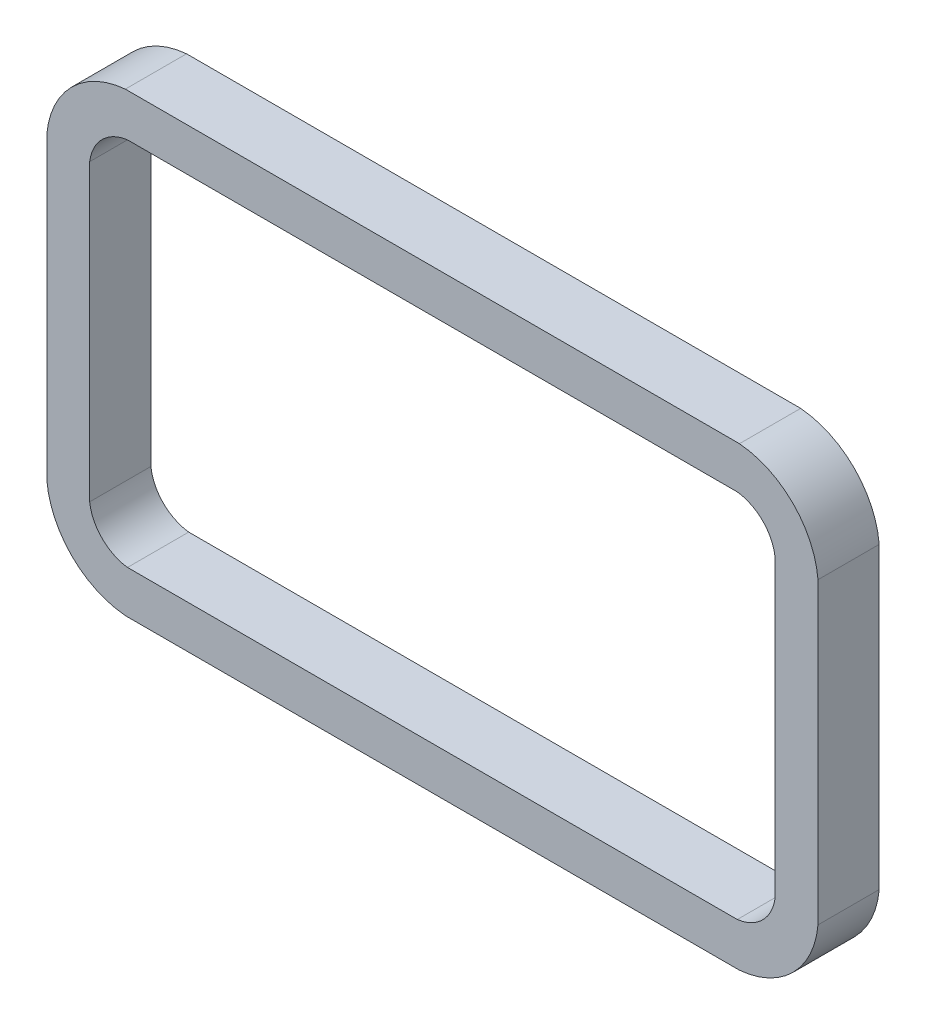
ISO-10303-21;
HEADER;
FILE_DESCRIPTION(('STEP AP214'),'2;1');
FILE_NAME('part.step','',(''),(''),'','','');
FILE_SCHEMA(('AUTOMOTIVE_DESIGN { 1 0 10303 214 1 1 1 1 }'));
ENDSEC;
DATA;
#1=APPLICATION_CONTEXT('core data for automotive mechanical design processes');
#2=APPLICATION_PROTOCOL_DEFINITION('international standard','automotive_design',2000,#1);
#3=PRODUCT_CONTEXT('',#1,'mechanical');
#4=PRODUCT('Part','Part','',(#3));
#5=PRODUCT_RELATED_PRODUCT_CATEGORY('part','',(#4));
#6=PRODUCT_DEFINITION_FORMATION('','',#4);
#7=PRODUCT_DEFINITION_CONTEXT('part definition',#1,'design');
#8=PRODUCT_DEFINITION('design','',#6,#7);
#9=PRODUCT_DEFINITION_SHAPE('','',#8);
#10=(LENGTH_UNIT() NAMED_UNIT(*) SI_UNIT(.MILLI.,.METRE.));
#11=(NAMED_UNIT(*) PLANE_ANGLE_UNIT() SI_UNIT($,.RADIAN.));
#12=(NAMED_UNIT(*) SI_UNIT($,.STERADIAN.) SOLID_ANGLE_UNIT());
#13=UNCERTAINTY_MEASURE_WITH_UNIT(LENGTH_MEASURE(1.E-05),#10,'distance_accuracy_value','');
#14=(GEOMETRIC_REPRESENTATION_CONTEXT(3) GLOBAL_UNCERTAINTY_ASSIGNED_CONTEXT((#13)) GLOBAL_UNIT_ASSIGNED_CONTEXT((#10,
#11,#12)) REPRESENTATION_CONTEXT('',''));
#15=CARTESIAN_POINT('',(0.,0.,0.));
#16=DIRECTION('',(0.,0.,1.));
#17=DIRECTION('',(1.,0.,0.));
#18=AXIS2_PLACEMENT_3D('',#15,#16,#17);
#19=CARTESIAN_POINT('',(48.9504839953527,23.2004839953527,10.));
#20=DIRECTION('',(0.,0.,-1.));
#21=DIRECTION('',(-1.,0.,0.));
#22=AXIS2_PLACEMENT_3D('',#19,#20,#21);
#23=PLANE('',#22);
#24=CARTESIAN_POINT('',(48.9504839953527,23.2004839953527,10.));
#25=DIRECTION('',(0.,0.,1.));
#26=DIRECTION('',(-1.,0.,0.));
#27=AXIS2_PLACEMENT_3D('',#24,#25,#26);
#28=CIRCLE('',#27,14.1023275814752);
#29=CARTESIAN_POINT('',(63.,24.4198048105588,10.));
#30=VERTEX_POINT('',#29);
#31=CARTESIAN_POINT('',(50.1698048105594,37.25,10.));
#32=VERTEX_POINT('',#31);
#33=EDGE_CURVE('E213',#30,#32,#28,.T.);
#34=ORIENTED_EDGE('',*,*,#33,.T.);
#35=DIRECTION('',(-1.,0.,0.));
#36=VECTOR('',#35,1.);
#37=CARTESIAN_POINT('',(50.1698048105594,37.25,10.));
#38=LINE('',#37,#36);
#39=CARTESIAN_POINT('',(-50.1698048105594,37.25,10.));
#40=VERTEX_POINT('',#39);
#41=EDGE_CURVE('E216',#32,#40,#38,.T.);
#42=ORIENTED_EDGE('',*,*,#41,.T.);
#43=CARTESIAN_POINT('',(-48.9504839953527,23.2004839953527,10.));
#44=DIRECTION('',(0.,0.,1.));
#45=DIRECTION('',(1.,0.,0.));
#46=AXIS2_PLACEMENT_3D('',#43,#44,#45);
#47=CIRCLE('',#46,14.1023275814752);
#48=CARTESIAN_POINT('',(-63.,24.4198048105588,10.));
#49=VERTEX_POINT('',#48);
#50=EDGE_CURVE('E219',#40,#49,#47,.T.);
#51=ORIENTED_EDGE('',*,*,#50,.T.);
#52=DIRECTION('',(0.,-1.,0.));
#53=VECTOR('',#52,1.);
#54=CARTESIAN_POINT('',(-63.,24.4198048105588,10.));
#55=LINE('',#54,#53);
#56=CARTESIAN_POINT('',(-63.,-24.4198048105588,10.));
#57=VERTEX_POINT('',#56);
#58=EDGE_CURVE('E221',#49,#57,#55,.T.);
#59=ORIENTED_EDGE('',*,*,#58,.T.);
#60=CARTESIAN_POINT('',(-48.9504839953527,-23.2004839953527,10.));
#61=DIRECTION('',(0.,0.,1.));
#62=DIRECTION('',(-1.,0.,0.));
#63=AXIS2_PLACEMENT_3D('',#60,#61,#62);
#64=CIRCLE('',#63,14.1023275814752);
#65=CARTESIAN_POINT('',(-50.1698048105594,-37.25,10.));
#66=VERTEX_POINT('',#65);
#67=EDGE_CURVE('E223',#57,#66,#64,.T.);
#68=ORIENTED_EDGE('',*,*,#67,.T.);
#69=DIRECTION('',(1.,0.,0.));
#70=VECTOR('',#69,1.);
#71=CARTESIAN_POINT('',(-50.1698048105594,-37.25,10.));
#72=LINE('',#71,#70);
#73=CARTESIAN_POINT('',(50.1698048105594,-37.25,10.));
#74=VERTEX_POINT('',#73);
#75=EDGE_CURVE('E225',#66,#74,#72,.T.);
#76=ORIENTED_EDGE('',*,*,#75,.T.);
#77=CARTESIAN_POINT('',(48.9504839953527,-23.2004839953527,10.));
#78=DIRECTION('',(0.,0.,1.));
#79=DIRECTION('',(1.,0.,0.));
#80=AXIS2_PLACEMENT_3D('',#77,#78,#79);
#81=CIRCLE('',#80,14.1023275814752);
#82=CARTESIAN_POINT('',(63.,-24.4198048105588,10.));
#83=VERTEX_POINT('',#82);
#84=EDGE_CURVE('E227',#74,#83,#81,.T.);
#85=ORIENTED_EDGE('',*,*,#84,.T.);
#86=DIRECTION('',(0.,1.,0.));
#87=VECTOR('',#86,1.);
#88=CARTESIAN_POINT('',(63.,-24.4198048105588,10.));
#89=LINE('',#88,#87);
#90=EDGE_CURVE('E229',#83,#30,#89,.T.);
#91=ORIENTED_EDGE('',*,*,#90,.T.);
#92=EDGE_LOOP('',(#34,#42,#51,#59,#68,#76,#85,#91));
#93=FACE_BOUND('',#92,.T.);
#94=CARTESIAN_POINT('',(48.9504839953527,-23.2004839953527,10.));
#95=DIRECTION('',(0.,0.,1.));
#96=DIRECTION('',(1.,0.,0.));
#97=AXIS2_PLACEMENT_3D('',#94,#95,#96);
#98=CIRCLE('',#97,7.10232758147521);
#99=CARTESIAN_POINT('',(49.8149960975264,-30.25,10.));
#100=VERTEX_POINT('',#99);
#101=CARTESIAN_POINT('',(56.,-24.0649960975262,10.));
#102=VERTEX_POINT('',#101);
#103=EDGE_CURVE('E148',#100,#102,#98,.T.);
#104=ORIENTED_EDGE('',*,*,#103,.F.);
#105=DIRECTION('',(1.,0.,0.));
#106=VECTOR('',#105,1.);
#107=CARTESIAN_POINT('',(-49.8149960975267,-30.25,10.));
#108=LINE('',#107,#106);
#109=CARTESIAN_POINT('',(-49.8149960975267,-30.25,10.));
#110=VERTEX_POINT('',#109);
#111=EDGE_CURVE('E181',#110,#100,#108,.T.);
#112=ORIENTED_EDGE('',*,*,#111,.F.);
#113=CARTESIAN_POINT('',(-48.9504839953527,-23.2004839953527,10.));
#114=DIRECTION('',(0.,0.,1.));
#115=DIRECTION('',(-1.,0.,0.));
#116=AXIS2_PLACEMENT_3D('',#113,#114,#115);
#117=CIRCLE('',#116,7.10232758147521);
#118=CARTESIAN_POINT('',(-56.,-24.0649960975263,10.));
#119=VERTEX_POINT('',#118);
#120=EDGE_CURVE('E179',#119,#110,#117,.T.);
#121=ORIENTED_EDGE('',*,*,#120,.F.);
#122=DIRECTION('',(0.,-1.,0.));
#123=VECTOR('',#122,1.);
#124=CARTESIAN_POINT('',(-56.,24.0649960975263,10.));
#125=LINE('',#124,#123);
#126=CARTESIAN_POINT('',(-56.,24.0649960975263,10.));
#127=VERTEX_POINT('',#126);
#128=EDGE_CURVE('E177',#127,#119,#125,.T.);
#129=ORIENTED_EDGE('',*,*,#128,.F.);
#130=CARTESIAN_POINT('',(-48.9504839953527,23.2004839953527,10.));
#131=DIRECTION('',(0.,0.,1.));
#132=DIRECTION('',(1.,0.,0.));
#133=AXIS2_PLACEMENT_3D('',#130,#131,#132);
#134=CIRCLE('',#133,7.10232758147521);
#135=CARTESIAN_POINT('',(-49.8149960975267,30.25,10.));
#136=VERTEX_POINT('',#135);
#137=EDGE_CURVE('E175',#136,#127,#134,.T.);
#138=ORIENTED_EDGE('',*,*,#137,.F.);
#139=DIRECTION('',(-1.,0.,0.));
#140=VECTOR('',#139,1.);
#141=CARTESIAN_POINT('',(49.8149960975267,30.25,10.));
#142=LINE('',#141,#140);
#143=CARTESIAN_POINT('',(49.8149960975267,30.25,10.));
#144=VERTEX_POINT('',#143);
#145=EDGE_CURVE('E171',#144,#136,#142,.T.);
#146=ORIENTED_EDGE('',*,*,#145,.F.);
#147=CARTESIAN_POINT('',(48.9504839953527,23.2004839953527,10.));
#148=DIRECTION('',(0.,0.,1.));
#149=DIRECTION('',(-1.,0.,0.));
#150=AXIS2_PLACEMENT_3D('',#147,#148,#149);
#151=CIRCLE('',#150,7.10232758147521);
#152=CARTESIAN_POINT('',(56.,24.0649960975265,10.));
#153=VERTEX_POINT('',#152);
#154=EDGE_CURVE('E169',#153,#144,#151,.T.);
#155=ORIENTED_EDGE('',*,*,#154,.F.);
#156=DIRECTION('',(0.,1.,0.));
#157=VECTOR('',#156,1.);
#158=CARTESIAN_POINT('',(56.,-24.0649960975262,10.));
#159=LINE('',#158,#157);
#160=EDGE_CURVE('E156',#102,#153,#159,.T.);
#161=ORIENTED_EDGE('',*,*,#160,.F.);
#162=EDGE_LOOP('',(#104,#112,#121,#129,#138,#146,#155,#161));
#163=FACE_BOUND('',#162,.T.);
#164=ADVANCED_FACE('F35',(#93,#163),#23,.F.);
#165=CARTESIAN_POINT('',(48.9504839953527,23.2004839953527,0.));
#166=DIRECTION('',(0.,0.,-1.));
#167=DIRECTION('',(-1.,0.,0.));
#168=AXIS2_PLACEMENT_3D('',#165,#166,#167);
#169=PLANE('',#168);
#170=CARTESIAN_POINT('',(48.9504839953527,23.2004839953527,0.));
#171=DIRECTION('',(0.,0.,1.));
#172=DIRECTION('',(-1.,0.,0.));
#173=AXIS2_PLACEMENT_3D('',#170,#171,#172);
#174=CIRCLE('',#173,14.1023275814752);
#175=CARTESIAN_POINT('',(63.,24.4198048105588,0.));
#176=VERTEX_POINT('',#175);
#177=CARTESIAN_POINT('',(50.1698048105594,37.25,0.));
#178=VERTEX_POINT('',#177);
#179=EDGE_CURVE('E164',#176,#178,#174,.T.);
#180=ORIENTED_EDGE('',*,*,#179,.F.);
#181=DIRECTION('',(0.,1.,0.));
#182=VECTOR('',#181,1.);
#183=CARTESIAN_POINT('',(63.,-24.4198048105588,0.));
#184=LINE('',#183,#182);
#185=CARTESIAN_POINT('',(63.,-24.4198048105588,0.));
#186=VERTEX_POINT('',#185);
#187=EDGE_CURVE('E217',#186,#176,#184,.T.);
#188=ORIENTED_EDGE('',*,*,#187,.F.);
#189=CARTESIAN_POINT('',(48.9504839953527,-23.2004839953527,0.));
#190=DIRECTION('',(0.,0.,1.));
#191=DIRECTION('',(1.,0.,0.));
#192=AXIS2_PLACEMENT_3D('',#189,#190,#191);
#193=CIRCLE('',#192,14.1023275814752);
#194=CARTESIAN_POINT('',(50.1698048105594,-37.25,0.));
#195=VERTEX_POINT('',#194);
#196=EDGE_CURVE('E244',#195,#186,#193,.T.);
#197=ORIENTED_EDGE('',*,*,#196,.F.);
#198=DIRECTION('',(1.,0.,0.));
#199=VECTOR('',#198,1.);
#200=CARTESIAN_POINT('',(-50.1698048105594,-37.25,0.));
#201=LINE('',#200,#199);
#202=CARTESIAN_POINT('',(-50.1698048105594,-37.25,0.));
#203=VERTEX_POINT('',#202);
#204=EDGE_CURVE('E242',#203,#195,#201,.T.);
#205=ORIENTED_EDGE('',*,*,#204,.F.);
#206=CARTESIAN_POINT('',(-48.9504839953527,-23.2004839953527,0.));
#207=DIRECTION('',(0.,0.,1.));
#208=DIRECTION('',(-1.,0.,0.));
#209=AXIS2_PLACEMENT_3D('',#206,#207,#208);
#210=CIRCLE('',#209,14.1023275814752);
#211=CARTESIAN_POINT('',(-63.,-24.4198048105588,0.));
#212=VERTEX_POINT('',#211);
#213=EDGE_CURVE('E240',#212,#203,#210,.T.);
#214=ORIENTED_EDGE('',*,*,#213,.F.);
#215=DIRECTION('',(0.,-1.,0.));
#216=VECTOR('',#215,1.);
#217=CARTESIAN_POINT('',(-63.,24.4198048105588,0.));
#218=LINE('',#217,#216);
#219=CARTESIAN_POINT('',(-63.,24.4198048105588,0.));
#220=VERTEX_POINT('',#219);
#221=EDGE_CURVE('E238',#220,#212,#218,.T.);
#222=ORIENTED_EDGE('',*,*,#221,.F.);
#223=CARTESIAN_POINT('',(-48.9504839953527,23.2004839953527,0.));
#224=DIRECTION('',(0.,0.,1.));
#225=DIRECTION('',(1.,0.,0.));
#226=AXIS2_PLACEMENT_3D('',#223,#224,#225);
#227=CIRCLE('',#226,14.1023275814752);
#228=CARTESIAN_POINT('',(-50.1698048105594,37.25,0.));
#229=VERTEX_POINT('',#228);
#230=EDGE_CURVE('E236',#229,#220,#227,.T.);
#231=ORIENTED_EDGE('',*,*,#230,.F.);
#232=DIRECTION('',(-1.,0.,0.));
#233=VECTOR('',#232,1.);
#234=CARTESIAN_POINT('',(50.1698048105594,37.25,0.));
#235=LINE('',#234,#233);
#236=EDGE_CURVE('E234',#178,#229,#235,.T.);
#237=ORIENTED_EDGE('',*,*,#236,.F.);
#238=EDGE_LOOP('',(#180,#188,#197,#205,#214,#222,#231,#237));
#239=FACE_BOUND('',#238,.T.);
#240=DIRECTION('',(1.,0.,0.));
#241=VECTOR('',#240,1.);
#242=CARTESIAN_POINT('',(-49.8149960975267,-30.25,0.));
#243=LINE('',#242,#241);
#244=CARTESIAN_POINT('',(-49.8149960975267,-30.25,0.));
#245=VERTEX_POINT('',#244);
#246=CARTESIAN_POINT('',(49.8149960975264,-30.25,0.));
#247=VERTEX_POINT('',#246);
#248=EDGE_CURVE('E157',#245,#247,#243,.T.);
#249=ORIENTED_EDGE('',*,*,#248,.T.);
#250=CARTESIAN_POINT('',(48.9504839953527,-23.2004839953527,0.));
#251=DIRECTION('',(0.,0.,1.));
#252=DIRECTION('',(1.,0.,0.));
#253=AXIS2_PLACEMENT_3D('',#250,#251,#252);
#254=CIRCLE('',#253,7.10232758147521);
#255=CARTESIAN_POINT('',(56.,-24.0649960975262,0.));
#256=VERTEX_POINT('',#255);
#257=EDGE_CURVE('E58',#247,#256,#254,.T.);
#258=ORIENTED_EDGE('',*,*,#257,.T.);
#259=DIRECTION('',(0.,1.,0.));
#260=VECTOR('',#259,1.);
#261=CARTESIAN_POINT('',(56.,-24.0649960975262,0.));
#262=LINE('',#261,#260);
#263=CARTESIAN_POINT('',(56.,24.0649960975265,0.));
#264=VERTEX_POINT('',#263);
#265=EDGE_CURVE('E163',#256,#264,#262,.T.);
#266=ORIENTED_EDGE('',*,*,#265,.T.);
#267=CARTESIAN_POINT('',(48.9504839953527,23.2004839953527,0.));
#268=DIRECTION('',(0.,0.,1.));
#269=DIRECTION('',(-1.,0.,0.));
#270=AXIS2_PLACEMENT_3D('',#267,#268,#269);
#271=CIRCLE('',#270,7.10232758147521);
#272=CARTESIAN_POINT('',(49.8149960975267,30.25,0.));
#273=VERTEX_POINT('',#272);
#274=EDGE_CURVE('E185',#264,#273,#271,.T.);
#275=ORIENTED_EDGE('',*,*,#274,.T.);
#276=DIRECTION('',(-1.,0.,0.));
#277=VECTOR('',#276,1.);
#278=CARTESIAN_POINT('',(49.8149960975267,30.25,0.));
#279=LINE('',#278,#277);
#280=CARTESIAN_POINT('',(-49.8149960975267,30.25,0.));
#281=VERTEX_POINT('',#280);
#282=EDGE_CURVE('E188',#273,#281,#279,.T.);
#283=ORIENTED_EDGE('',*,*,#282,.T.);
#284=CARTESIAN_POINT('',(-48.9504839953527,23.2004839953527,0.));
#285=DIRECTION('',(0.,0.,1.));
#286=DIRECTION('',(1.,0.,0.));
#287=AXIS2_PLACEMENT_3D('',#284,#285,#286);
#288=CIRCLE('',#287,7.10232758147521);
#289=CARTESIAN_POINT('',(-56.,24.0649960975263,0.));
#290=VERTEX_POINT('',#289);
#291=EDGE_CURVE('E191',#281,#290,#288,.T.);
#292=ORIENTED_EDGE('',*,*,#291,.T.);
#293=DIRECTION('',(0.,-1.,0.));
#294=VECTOR('',#293,1.);
#295=CARTESIAN_POINT('',(-56.,24.0649960975263,0.));
#296=LINE('',#295,#294);
#297=CARTESIAN_POINT('',(-56.,-24.0649960975263,0.));
#298=VERTEX_POINT('',#297);
#299=EDGE_CURVE('E194',#290,#298,#296,.T.);
#300=ORIENTED_EDGE('',*,*,#299,.T.);
#301=CARTESIAN_POINT('',(-48.9504839953527,-23.2004839953527,0.));
#302=DIRECTION('',(0.,0.,1.));
#303=DIRECTION('',(-1.,0.,0.));
#304=AXIS2_PLACEMENT_3D('',#301,#302,#303);
#305=CIRCLE('',#304,7.10232758147521);
#306=EDGE_CURVE('E197',#298,#245,#305,.T.);
#307=ORIENTED_EDGE('',*,*,#306,.T.);
#308=EDGE_LOOP('',(#249,#258,#266,#275,#283,#292,#300,#307));
#309=FACE_BOUND('',#308,.T.);
#310=ADVANCED_FACE('F274',(#239,#309),#169,.T.);
#311=CARTESIAN_POINT('',(48.9504839953527,23.2004839953527,10.));
#312=DIRECTION('',(0.,0.,-1.));
#313=DIRECTION('',(-1.,0.,0.));
#314=AXIS2_PLACEMENT_3D('',#311,#312,#313);
#315=CYLINDRICAL_SURFACE('',#314,14.1023275814752);
#316=ORIENTED_EDGE('',*,*,#179,.T.);
#317=DIRECTION('',(0.,0.,-1.));
#318=VECTOR('',#317,1.);
#319=CARTESIAN_POINT('',(50.1698048105594,37.25,10.));
#320=LINE('',#319,#318);
#321=EDGE_CURVE('E11',#32,#178,#320,.T.);
#322=ORIENTED_EDGE('',*,*,#321,.F.);
#323=ORIENTED_EDGE('',*,*,#33,.F.);
#324=DIRECTION('',(0.,0.,-1.));
#325=VECTOR('',#324,1.);
#326=CARTESIAN_POINT('',(63.,24.4198048105588,10.));
#327=LINE('',#326,#325);
#328=EDGE_CURVE('E231',#30,#176,#327,.T.);
#329=ORIENTED_EDGE('',*,*,#328,.T.);
#330=EDGE_LOOP('',(#316,#322,#323,#329));
#331=FACE_BOUND('',#330,.T.);
#332=ADVANCED_FACE('F37',(#331),#315,.T.);
#333=CARTESIAN_POINT('',(50.1698048105594,37.25,10.));
#334=DIRECTION('',(0.,-1.,0.));
#335=DIRECTION('',(0.,0.,-1.));
#336=AXIS2_PLACEMENT_3D('',#333,#334,#335);
#337=PLANE('',#336);
#338=ORIENTED_EDGE('',*,*,#236,.T.);
#339=DIRECTION('',(0.,0.,-1.));
#340=VECTOR('',#339,1.);
#341=CARTESIAN_POINT('',(-50.1698048105594,37.25,10.));
#342=LINE('',#341,#340);
#343=EDGE_CURVE('E43',#40,#229,#342,.T.);
#344=ORIENTED_EDGE('',*,*,#343,.F.);
#345=ORIENTED_EDGE('',*,*,#41,.F.);
#346=ORIENTED_EDGE('',*,*,#321,.T.);
#347=EDGE_LOOP('',(#338,#344,#345,#346));
#348=FACE_BOUND('',#347,.T.);
#349=ADVANCED_FACE('F291',(#348),#337,.F.);
#350=CARTESIAN_POINT('',(-48.9504839953527,23.2004839953527,10.));
#351=DIRECTION('',(0.,0.,-1.));
#352=DIRECTION('',(-1.,0.,0.));
#353=AXIS2_PLACEMENT_3D('',#350,#351,#352);
#354=CYLINDRICAL_SURFACE('',#353,14.1023275814752);
#355=ORIENTED_EDGE('',*,*,#230,.T.);
#356=DIRECTION('',(0.,0.,-1.));
#357=VECTOR('',#356,1.);
#358=CARTESIAN_POINT('',(-63.,24.4198048105588,10.));
#359=LINE('',#358,#357);
#360=EDGE_CURVE('E261',#49,#220,#359,.T.);
#361=ORIENTED_EDGE('',*,*,#360,.F.);
#362=ORIENTED_EDGE('',*,*,#50,.F.);
#363=ORIENTED_EDGE('',*,*,#343,.T.);
#364=EDGE_LOOP('',(#355,#361,#362,#363));
#365=FACE_BOUND('',#364,.T.);
#366=ADVANCED_FACE('F268',(#365),#354,.T.);
#367=CARTESIAN_POINT('',(-63.,24.4198048105588,10.));
#368=DIRECTION('',(1.,0.,0.));
#369=DIRECTION('',(0.,0.,-1.));
#370=AXIS2_PLACEMENT_3D('',#367,#368,#369);
#371=PLANE('',#370);
#372=ORIENTED_EDGE('',*,*,#221,.T.);
#373=DIRECTION('',(0.,0.,-1.));
#374=VECTOR('',#373,1.);
#375=CARTESIAN_POINT('',(-63.,-24.4198048105588,10.));
#376=LINE('',#375,#374);
#377=EDGE_CURVE('E258',#57,#212,#376,.T.);
#378=ORIENTED_EDGE('',*,*,#377,.F.);
#379=ORIENTED_EDGE('',*,*,#58,.F.);
#380=ORIENTED_EDGE('',*,*,#360,.T.);
#381=EDGE_LOOP('',(#372,#378,#379,#380));
#382=FACE_BOUND('',#381,.T.);
#383=ADVANCED_FACE('F280',(#382),#371,.F.);
#384=CARTESIAN_POINT('',(-48.9504839953527,-23.2004839953527,10.));
#385=DIRECTION('',(0.,0.,-1.));
#386=DIRECTION('',(-1.,0.,0.));
#387=AXIS2_PLACEMENT_3D('',#384,#385,#386);
#388=CYLINDRICAL_SURFACE('',#387,14.1023275814752);
#389=ORIENTED_EDGE('',*,*,#213,.T.);
#390=DIRECTION('',(0.,0.,-1.));
#391=VECTOR('',#390,1.);
#392=CARTESIAN_POINT('',(-50.1698048105594,-37.25,10.));
#393=LINE('',#392,#391);
#394=EDGE_CURVE('E255',#66,#203,#393,.T.);
#395=ORIENTED_EDGE('',*,*,#394,.F.);
#396=ORIENTED_EDGE('',*,*,#67,.F.);
#397=ORIENTED_EDGE('',*,*,#377,.T.);
#398=EDGE_LOOP('',(#389,#395,#396,#397));
#399=FACE_BOUND('',#398,.T.);
#400=ADVANCED_FACE('F284',(#399),#388,.T.);
#401=CARTESIAN_POINT('',(-50.1698048105594,-37.25,10.));
#402=DIRECTION('',(0.,1.,0.));
#403=DIRECTION('',(0.,0.,1.));
#404=AXIS2_PLACEMENT_3D('',#401,#402,#403);
#405=PLANE('',#404);
#406=ORIENTED_EDGE('',*,*,#204,.T.);
#407=DIRECTION('',(0.,0.,-1.));
#408=VECTOR('',#407,1.);
#409=CARTESIAN_POINT('',(50.1698048105594,-37.25,10.));
#410=LINE('',#409,#408);
#411=EDGE_CURVE('E252',#74,#195,#410,.T.);
#412=ORIENTED_EDGE('',*,*,#411,.F.);
#413=ORIENTED_EDGE('',*,*,#75,.F.);
#414=ORIENTED_EDGE('',*,*,#394,.T.);
#415=EDGE_LOOP('',(#406,#412,#413,#414));
#416=FACE_BOUND('',#415,.T.);
#417=ADVANCED_FACE('F304',(#416),#405,.F.);
#418=CARTESIAN_POINT('',(48.9504839953527,-23.2004839953527,10.));
#419=DIRECTION('',(0.,0.,-1.));
#420=DIRECTION('',(-1.,0.,0.));
#421=AXIS2_PLACEMENT_3D('',#418,#419,#420);
#422=CYLINDRICAL_SURFACE('',#421,14.1023275814752);
#423=ORIENTED_EDGE('',*,*,#196,.T.);
#424=DIRECTION('',(0.,0.,-1.));
#425=VECTOR('',#424,1.);
#426=CARTESIAN_POINT('',(63.,-24.4198048105588,10.));
#427=LINE('',#426,#425);
#428=EDGE_CURVE('E249',#83,#186,#427,.T.);
#429=ORIENTED_EDGE('',*,*,#428,.F.);
#430=ORIENTED_EDGE('',*,*,#84,.F.);
#431=ORIENTED_EDGE('',*,*,#411,.T.);
#432=EDGE_LOOP('',(#423,#429,#430,#431));
#433=FACE_BOUND('',#432,.T.);
#434=ADVANCED_FACE('F302',(#433),#422,.T.);
#435=CARTESIAN_POINT('',(63.,-24.4198048105588,10.));
#436=DIRECTION('',(-1.,0.,0.));
#437=DIRECTION('',(0.,-1.,0.));
#438=AXIS2_PLACEMENT_3D('',#435,#436,#437);
#439=PLANE('',#438);
#440=ORIENTED_EDGE('',*,*,#187,.T.);
#441=ORIENTED_EDGE('',*,*,#328,.F.);
#442=ORIENTED_EDGE('',*,*,#90,.F.);
#443=ORIENTED_EDGE('',*,*,#428,.T.);
#444=EDGE_LOOP('',(#440,#441,#442,#443));
#445=FACE_BOUND('',#444,.T.);
#446=ADVANCED_FACE('F297',(#445),#439,.F.);
#447=CARTESIAN_POINT('',(48.9504839953527,-23.2004839953527,10.));
#448=DIRECTION('',(0.,0.,-1.));
#449=DIRECTION('',(-1.,0.,0.));
#450=AXIS2_PLACEMENT_3D('',#447,#448,#449);
#451=CYLINDRICAL_SURFACE('',#450,7.10232758147521);
#452=ORIENTED_EDGE('',*,*,#257,.F.);
#453=DIRECTION('',(0.,0.,-1.));
#454=VECTOR('',#453,1.);
#455=CARTESIAN_POINT('',(49.8149960975264,-30.25,10.));
#456=LINE('',#455,#454);
#457=EDGE_CURVE('E152',#100,#247,#456,.T.);
#458=ORIENTED_EDGE('',*,*,#457,.F.);
#459=ORIENTED_EDGE('',*,*,#103,.T.);
#460=DIRECTION('',(0.,0.,-1.));
#461=VECTOR('',#460,1.);
#462=CARTESIAN_POINT('',(56.,-24.0649960975262,10.));
#463=LINE('',#462,#461);
#464=EDGE_CURVE('E151',#102,#256,#463,.T.);
#465=ORIENTED_EDGE('',*,*,#464,.T.);
#466=EDGE_LOOP('',(#452,#458,#459,#465));
#467=FACE_BOUND('',#466,.T.);
#468=ADVANCED_FACE('F150',(#467),#451,.F.);
#469=CARTESIAN_POINT('',(56.,-24.0649960975262,10.));
#470=DIRECTION('',(-1.,0.,0.));
#471=DIRECTION('',(0.,-1.,0.));
#472=AXIS2_PLACEMENT_3D('',#469,#470,#471);
#473=PLANE('',#472);
#474=ORIENTED_EDGE('',*,*,#265,.F.);
#475=ORIENTED_EDGE('',*,*,#464,.F.);
#476=ORIENTED_EDGE('',*,*,#160,.T.);
#477=DIRECTION('',(0.,0.,-1.));
#478=VECTOR('',#477,1.);
#479=CARTESIAN_POINT('',(56.,24.0649960975265,10.));
#480=LINE('',#479,#478);
#481=EDGE_CURVE('E165',#153,#264,#480,.T.);
#482=ORIENTED_EDGE('',*,*,#481,.T.);
#483=EDGE_LOOP('',(#474,#475,#476,#482));
#484=FACE_BOUND('',#483,.T.);
#485=ADVANCED_FACE('F160',(#484),#473,.T.);
#486=CARTESIAN_POINT('',(48.9504839953527,23.2004839953527,10.));
#487=DIRECTION('',(0.,0.,-1.));
#488=DIRECTION('',(-1.,0.,0.));
#489=AXIS2_PLACEMENT_3D('',#486,#487,#488);
#490=CYLINDRICAL_SURFACE('',#489,7.10232758147521);
#491=ORIENTED_EDGE('',*,*,#274,.F.);
#492=ORIENTED_EDGE('',*,*,#481,.F.);
#493=ORIENTED_EDGE('',*,*,#154,.T.);
#494=DIRECTION('',(0.,0.,-1.));
#495=VECTOR('',#494,1.);
#496=CARTESIAN_POINT('',(49.8149960975267,30.25,10.));
#497=LINE('',#496,#495);
#498=EDGE_CURVE('E210',#144,#273,#497,.T.);
#499=ORIENTED_EDGE('',*,*,#498,.T.);
#500=EDGE_LOOP('',(#491,#492,#493,#499));
#501=FACE_BOUND('',#500,.T.);
#502=ADVANCED_FACE('F329',(#501),#490,.F.);
#503=CARTESIAN_POINT('',(49.8149960975267,30.25,10.));
#504=DIRECTION('',(0.,-1.,0.));
#505=DIRECTION('',(0.,0.,-1.));
#506=AXIS2_PLACEMENT_3D('',#503,#504,#505);
#507=PLANE('',#506);
#508=ORIENTED_EDGE('',*,*,#282,.F.);
#509=ORIENTED_EDGE('',*,*,#498,.F.);
#510=ORIENTED_EDGE('',*,*,#145,.T.);
#511=DIRECTION('',(0.,0.,-1.));
#512=VECTOR('',#511,1.);
#513=CARTESIAN_POINT('',(-49.8149960975267,30.25,10.));
#514=LINE('',#513,#512);
#515=EDGE_CURVE('E208',#136,#281,#514,.T.);
#516=ORIENTED_EDGE('',*,*,#515,.T.);
#517=EDGE_LOOP('',(#508,#509,#510,#516));
#518=FACE_BOUND('',#517,.T.);
#519=ADVANCED_FACE('F333',(#518),#507,.T.);
#520=CARTESIAN_POINT('',(-48.9504839953527,23.2004839953527,10.));
#521=DIRECTION('',(0.,0.,-1.));
#522=DIRECTION('',(-1.,0.,0.));
#523=AXIS2_PLACEMENT_3D('',#520,#521,#522);
#524=CYLINDRICAL_SURFACE('',#523,7.10232758147521);
#525=ORIENTED_EDGE('',*,*,#291,.F.);
#526=ORIENTED_EDGE('',*,*,#515,.F.);
#527=ORIENTED_EDGE('',*,*,#137,.T.);
#528=DIRECTION('',(0.,0.,-1.));
#529=VECTOR('',#528,1.);
#530=CARTESIAN_POINT('',(-56.,24.0649960975263,10.));
#531=LINE('',#530,#529);
#532=EDGE_CURVE('E206',#127,#290,#531,.T.);
#533=ORIENTED_EDGE('',*,*,#532,.T.);
#534=EDGE_LOOP('',(#525,#526,#527,#533));
#535=FACE_BOUND('',#534,.T.);
#536=ADVANCED_FACE('F339',(#535),#524,.F.);
#537=CARTESIAN_POINT('',(-56.,24.0649960975263,10.));
#538=DIRECTION('',(1.,0.,0.));
#539=DIRECTION('',(0.,0.,-1.));
#540=AXIS2_PLACEMENT_3D('',#537,#538,#539);
#541=PLANE('',#540);
#542=ORIENTED_EDGE('',*,*,#299,.F.);
#543=ORIENTED_EDGE('',*,*,#532,.F.);
#544=ORIENTED_EDGE('',*,*,#128,.T.);
#545=DIRECTION('',(0.,0.,-1.));
#546=VECTOR('',#545,1.);
#547=CARTESIAN_POINT('',(-56.,-24.0649960975263,10.));
#548=LINE('',#547,#546);
#549=EDGE_CURVE('E204',#119,#298,#548,.T.);
#550=ORIENTED_EDGE('',*,*,#549,.T.);
#551=EDGE_LOOP('',(#542,#543,#544,#550));
#552=FACE_BOUND('',#551,.T.);
#553=ADVANCED_FACE('F343',(#552),#541,.T.);
#554=CARTESIAN_POINT('',(-48.9504839953527,-23.2004839953527,10.));
#555=DIRECTION('',(0.,0.,-1.));
#556=DIRECTION('',(-1.,0.,0.));
#557=AXIS2_PLACEMENT_3D('',#554,#555,#556);
#558=CYLINDRICAL_SURFACE('',#557,7.10232758147521);
#559=ORIENTED_EDGE('',*,*,#306,.F.);
#560=ORIENTED_EDGE('',*,*,#549,.F.);
#561=ORIENTED_EDGE('',*,*,#120,.T.);
#562=DIRECTION('',(0.,0.,-1.));
#563=VECTOR('',#562,1.);
#564=CARTESIAN_POINT('',(-49.8149960975267,-30.25,10.));
#565=LINE('',#564,#563);
#566=EDGE_CURVE('E50',#110,#245,#565,.T.);
#567=ORIENTED_EDGE('',*,*,#566,.T.);
#568=EDGE_LOOP('',(#559,#560,#561,#567));
#569=FACE_BOUND('',#568,.T.);
#570=ADVANCED_FACE('F347',(#569),#558,.F.);
#571=CARTESIAN_POINT('',(-49.8149960975267,-30.25,10.));
#572=DIRECTION('',(0.,1.,0.));
#573=DIRECTION('',(0.,0.,1.));
#574=AXIS2_PLACEMENT_3D('',#571,#572,#573);
#575=PLANE('',#574);
#576=ORIENTED_EDGE('',*,*,#248,.F.);
#577=ORIENTED_EDGE('',*,*,#566,.F.);
#578=ORIENTED_EDGE('',*,*,#111,.T.);
#579=ORIENTED_EDGE('',*,*,#457,.T.);
#580=EDGE_LOOP('',(#576,#577,#578,#579));
#581=FACE_BOUND('',#580,.T.);
#582=ADVANCED_FACE('F351',(#581),#575,.T.);
#583=CLOSED_SHELL('',(#164,#310,#332,#349,#366,#383,#400,#417,#434,#446,#468,#485,#502,#519,
#536,#553,#570,#582));
#584=MANIFOLD_SOLID_BREP('B2',#583);
#585=ADVANCED_BREP_SHAPE_REPRESENTATION('',(#18,#584),#14);
#586=SHAPE_DEFINITION_REPRESENTATION(#9,#585);
ENDSEC;
END-ISO-10303-21;
